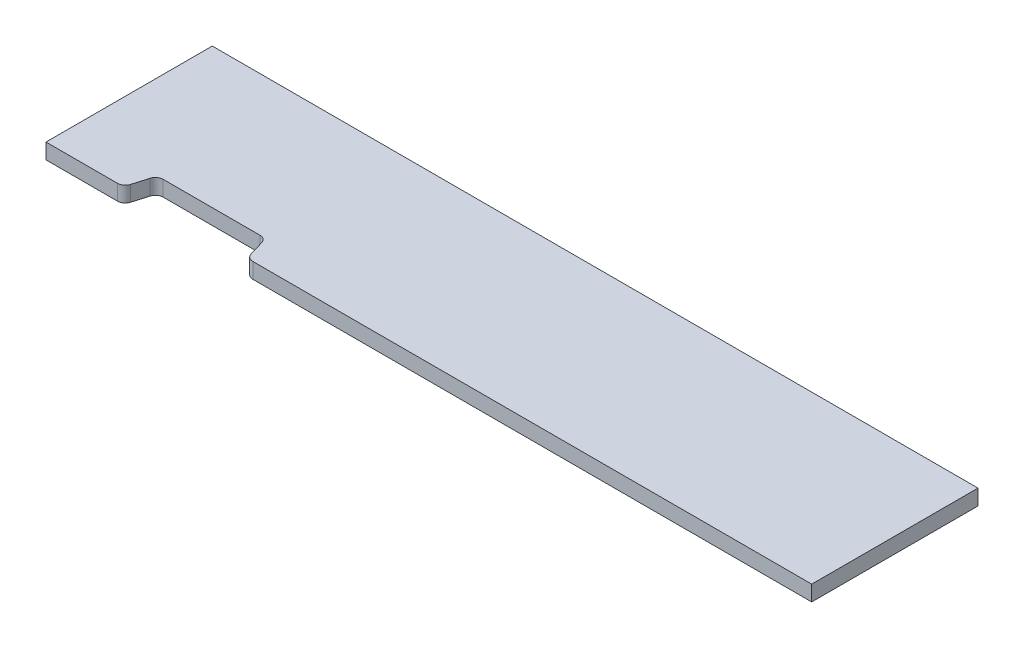
ISO-10303-21;
HEADER;
FILE_DESCRIPTION(('STEP AP214'),'2;1');
FILE_NAME('part.step','',(''),(''),'','','');
FILE_SCHEMA(('AUTOMOTIVE_DESIGN { 1 0 10303 214 1 1 1 1 }'));
ENDSEC;
DATA;
#1=APPLICATION_CONTEXT('core data for automotive mechanical design processes');
#2=APPLICATION_PROTOCOL_DEFINITION('international standard','automotive_design',2000,#1);
#3=PRODUCT_CONTEXT('',#1,'mechanical');
#4=PRODUCT('Part','Part','',(#3));
#5=PRODUCT_RELATED_PRODUCT_CATEGORY('part','',(#4));
#6=PRODUCT_DEFINITION_FORMATION('','',#4);
#7=PRODUCT_DEFINITION_CONTEXT('part definition',#1,'design');
#8=PRODUCT_DEFINITION('design','',#6,#7);
#9=PRODUCT_DEFINITION_SHAPE('','',#8);
#10=(LENGTH_UNIT() NAMED_UNIT(*) SI_UNIT(.MILLI.,.METRE.));
#11=(NAMED_UNIT(*) PLANE_ANGLE_UNIT() SI_UNIT($,.RADIAN.));
#12=(NAMED_UNIT(*) SI_UNIT($,.STERADIAN.) SOLID_ANGLE_UNIT());
#13=UNCERTAINTY_MEASURE_WITH_UNIT(LENGTH_MEASURE(1.E-05),#10,'distance_accuracy_value','');
#14=(GEOMETRIC_REPRESENTATION_CONTEXT(3) GLOBAL_UNCERTAINTY_ASSIGNED_CONTEXT((#13)) GLOBAL_UNIT_ASSIGNED_CONTEXT((#10,
#11,#12)) REPRESENTATION_CONTEXT('',''));
#15=CARTESIAN_POINT('',(0.,0.,0.));
#16=DIRECTION('',(0.,0.,1.));
#17=DIRECTION('',(1.,0.,0.));
#18=AXIS2_PLACEMENT_3D('',#15,#16,#17);
#19=CARTESIAN_POINT('',(-314.325,-12.7,68.2625));
#20=DIRECTION('',(0.,0.,1.));
#21=DIRECTION('',(1.,0.,0.));
#22=AXIS2_PLACEMENT_3D('',#19,#20,#21);
#23=PLANE('',#22);
#24=DIRECTION('',(1.,0.,0.));
#25=VECTOR('',#24,1.);
#26=CARTESIAN_POINT('',(-314.325,-12.7,68.2625));
#27=LINE('',#26,#25);
#28=CARTESIAN_POINT('',(-314.325,-12.7,68.2625));
#29=VERTEX_POINT('',#28);
#30=CARTESIAN_POINT('',(-255.576310981256,-12.7,68.2625));
#31=VERTEX_POINT('',#30);
#32=EDGE_CURVE('E135',#29,#31,#27,.T.);
#33=ORIENTED_EDGE('',*,*,#32,.T.);
#34=DIRECTION('',(0.,1.,0.));
#35=VECTOR('',#34,1.);
#36=CARTESIAN_POINT('',(-255.576310981256,0.,68.2625));
#37=LINE('',#36,#35);
#38=CARTESIAN_POINT('',(-255.576310981256,0.,68.2625));
#39=VERTEX_POINT('',#38);
#40=EDGE_CURVE('E195',#31,#39,#37,.T.);
#41=ORIENTED_EDGE('',*,*,#40,.T.);
#42=DIRECTION('',(1.,0.,0.));
#43=VECTOR('',#42,1.);
#44=CARTESIAN_POINT('',(-314.325,0.,68.2625));
#45=LINE('',#44,#43);
#46=CARTESIAN_POINT('',(-314.325,0.,68.2625));
#47=VERTEX_POINT('',#46);
#48=EDGE_CURVE('E149',#47,#39,#45,.T.);
#49=ORIENTED_EDGE('',*,*,#48,.F.);
#50=DIRECTION('',(0.,1.,0.));
#51=VECTOR('',#50,1.);
#52=CARTESIAN_POINT('',(-314.325,-12.7,68.2625));
#53=LINE('',#52,#51);
#54=EDGE_CURVE('E170',#29,#47,#53,.T.);
#55=ORIENTED_EDGE('',*,*,#54,.F.);
#56=EDGE_LOOP('',(#33,#41,#49,#55));
#57=FACE_BOUND('',#56,.T.);
#58=ADVANCED_FACE('F33',(#57),#23,.T.);
#59=CARTESIAN_POINT('',(314.325,-12.7,68.2625));
#60=DIRECTION('',(1.,0.,0.));
#61=DIRECTION('',(0.,0.,-1.));
#62=AXIS2_PLACEMENT_3D('',#59,#60,#61);
#63=PLANE('',#62);
#64=DIRECTION('',(0.,0.,-1.));
#65=VECTOR('',#64,1.);
#66=CARTESIAN_POINT('',(314.325,0.,68.2625));
#67=LINE('',#66,#65);
#68=CARTESIAN_POINT('',(314.325,0.,68.2625));
#69=VERTEX_POINT('',#68);
#70=CARTESIAN_POINT('',(314.325,0.,-68.2625));
#71=VERTEX_POINT('',#70);
#72=EDGE_CURVE('E161',#69,#71,#67,.T.);
#73=ORIENTED_EDGE('',*,*,#72,.F.);
#74=DIRECTION('',(0.,1.,0.));
#75=VECTOR('',#74,1.);
#76=CARTESIAN_POINT('',(314.325,-12.7,68.2625));
#77=LINE('',#76,#75);
#78=CARTESIAN_POINT('',(314.325,-12.7,68.2625));
#79=VERTEX_POINT('',#78);
#80=EDGE_CURVE('E148',#79,#69,#77,.T.);
#81=ORIENTED_EDGE('',*,*,#80,.F.);
#82=DIRECTION('',(0.,0.,-1.));
#83=VECTOR('',#82,1.);
#84=CARTESIAN_POINT('',(314.325,-12.7,68.2625));
#85=LINE('',#84,#83);
#86=CARTESIAN_POINT('',(314.325,-12.7,-68.2625));
#87=VERTEX_POINT('',#86);
#88=EDGE_CURVE('E141',#79,#87,#85,.T.);
#89=ORIENTED_EDGE('',*,*,#88,.T.);
#90=DIRECTION('',(0.,1.,0.));
#91=VECTOR('',#90,1.);
#92=CARTESIAN_POINT('',(314.325,-12.7,-68.2625));
#93=LINE('',#92,#91);
#94=EDGE_CURVE('E124',#87,#71,#93,.T.);
#95=ORIENTED_EDGE('',*,*,#94,.T.);
#96=EDGE_LOOP('',(#73,#81,#89,#95));
#97=FACE_BOUND('',#96,.T.);
#98=ADVANCED_FACE('F146',(#97),#63,.T.);
#99=CARTESIAN_POINT('',(-144.473689018744,0.,68.2625));
#100=VERTEX_POINT('',#99);
#101=EDGE_CURVE('E152',#100,#69,#45,.T.);
#102=ORIENTED_EDGE('',*,*,#101,.F.);
#103=DIRECTION('',(0.,1.,0.));
#104=VECTOR('',#103,1.);
#105=CARTESIAN_POINT('',(-144.473689018744,-12.7,68.2625));
#106=LINE('',#105,#104);
#107=CARTESIAN_POINT('',(-144.473689018744,-12.7,68.2625));
#108=VERTEX_POINT('',#107);
#109=EDGE_CURVE('E186',#100,#108,#106,.F.);
#110=ORIENTED_EDGE('',*,*,#109,.T.);
#111=EDGE_CURVE('E159',#108,#79,#27,.T.);
#112=ORIENTED_EDGE('',*,*,#111,.T.);
#113=ORIENTED_EDGE('',*,*,#80,.T.);
#114=EDGE_LOOP('',(#102,#110,#112,#113));
#115=FACE_BOUND('',#114,.T.);
#116=ADVANCED_FACE('F245',(#115),#23,.T.);
#117=CARTESIAN_POINT('',(-314.325,-12.7,68.2625));
#118=DIRECTION('',(-1.,0.,0.));
#119=DIRECTION('',(0.,0.,1.));
#120=AXIS2_PLACEMENT_3D('',#117,#118,#119);
#121=PLANE('',#120);
#122=DIRECTION('',(0.,0.,1.));
#123=VECTOR('',#122,1.);
#124=CARTESIAN_POINT('',(-314.325,0.,68.2625));
#125=LINE('',#124,#123);
#126=CARTESIAN_POINT('',(-314.325,0.,-68.2625));
#127=VERTEX_POINT('',#126);
#128=EDGE_CURVE('E165',#127,#47,#125,.T.);
#129=ORIENTED_EDGE('',*,*,#128,.F.);
#130=DIRECTION('',(0.,1.,0.));
#131=VECTOR('',#130,1.);
#132=CARTESIAN_POINT('',(-314.325,-12.7,-68.2625));
#133=LINE('',#132,#131);
#134=CARTESIAN_POINT('',(-314.325,-12.7,-68.2625));
#135=VERTEX_POINT('',#134);
#136=EDGE_CURVE('E134',#135,#127,#133,.T.);
#137=ORIENTED_EDGE('',*,*,#136,.F.);
#138=DIRECTION('',(0.,0.,1.));
#139=VECTOR('',#138,1.);
#140=CARTESIAN_POINT('',(-314.325,-12.7,68.2625));
#141=LINE('',#140,#139);
#142=EDGE_CURVE('E143',#135,#29,#141,.T.);
#143=ORIENTED_EDGE('',*,*,#142,.T.);
#144=ORIENTED_EDGE('',*,*,#54,.T.);
#145=EDGE_LOOP('',(#129,#137,#143,#144));
#146=FACE_BOUND('',#145,.T.);
#147=ADVANCED_FACE('F243',(#146),#121,.T.);
#148=CARTESIAN_POINT('',(-314.325,-12.7,-68.2625));
#149=DIRECTION('',(0.,0.,-1.));
#150=DIRECTION('',(-1.,0.,0.));
#151=AXIS2_PLACEMENT_3D('',#148,#149,#150);
#152=PLANE('',#151);
#153=DIRECTION('',(-1.,0.,0.));
#154=VECTOR('',#153,1.);
#155=CARTESIAN_POINT('',(-314.325,0.,-68.2625));
#156=LINE('',#155,#154);
#157=EDGE_CURVE('E129',#71,#127,#156,.T.);
#158=ORIENTED_EDGE('',*,*,#157,.F.);
#159=ORIENTED_EDGE('',*,*,#94,.F.);
#160=DIRECTION('',(-1.,0.,0.));
#161=VECTOR('',#160,1.);
#162=CARTESIAN_POINT('',(-314.325,-12.7,-68.2625));
#163=LINE('',#162,#161);
#164=EDGE_CURVE('E127',#87,#135,#163,.T.);
#165=ORIENTED_EDGE('',*,*,#164,.T.);
#166=ORIENTED_EDGE('',*,*,#136,.T.);
#167=EDGE_LOOP('',(#158,#159,#165,#166));
#168=FACE_BOUND('',#167,.T.);
#169=ADVANCED_FACE('F126',(#168),#152,.T.);
#170=CARTESIAN_POINT('',(0.,-12.7,0.));
#171=DIRECTION('',(0.,-1.,0.));
#172=DIRECTION('',(0.,0.,-1.));
#173=AXIS2_PLACEMENT_3D('',#170,#171,#172);
#174=PLANE('',#173);
#175=ORIENTED_EDGE('',*,*,#111,.F.);
#176=CARTESIAN_POINT('',(-144.473689018744,-12.7,61.9125));
#177=DIRECTION('',(0.,-1.,0.));
#178=DIRECTION('',(0.,0.,-1.));
#179=AXIS2_PLACEMENT_3D('',#176,#177,#178);
#180=CIRCLE('',#179,6.35);
#181=CARTESIAN_POINT('',(-150.565659953722,-12.7,63.7042561573464));
#182=VERTEX_POINT('',#181);
#183=EDGE_CURVE('E189',#108,#182,#180,.T.);
#184=ORIENTED_EDGE('',*,*,#183,.T.);
#185=DIRECTION('',(-0.28216632399155,0.,-0.959365501571271));
#186=VECTOR('',#185,1.);
#187=CARTESIAN_POINT('',(-155.575,-12.7,46.6725));
#188=LINE('',#187,#186);
#189=CARTESIAN_POINT('',(-154.234340046278,-12.7,51.2307438426537));
#190=VERTEX_POINT('',#189);
#191=EDGE_CURVE('E222',#182,#190,#188,.T.);
#192=ORIENTED_EDGE('',*,*,#191,.T.);
#193=CARTESIAN_POINT('',(-160.326310981256,-12.7,53.0225));
#194=DIRECTION('',(0.,-1.,0.));
#195=DIRECTION('',(0.,0.,-1.));
#196=AXIS2_PLACEMENT_3D('',#193,#194,#195);
#197=CIRCLE('',#196,6.35);
#198=CARTESIAN_POINT('',(-160.326310981256,-12.7,46.6725));
#199=VERTEX_POINT('',#198);
#200=EDGE_CURVE('E200',#190,#199,#197,.F.);
#201=ORIENTED_EDGE('',*,*,#200,.T.);
#202=DIRECTION('',(-1.,0.,0.));
#203=VECTOR('',#202,1.);
#204=CARTESIAN_POINT('',(-244.475,-12.7,46.6725));
#205=LINE('',#204,#203);
#206=CARTESIAN_POINT('',(-239.723689018744,-12.7,46.6725));
#207=VERTEX_POINT('',#206);
#208=EDGE_CURVE('E219',#199,#207,#205,.T.);
#209=ORIENTED_EDGE('',*,*,#208,.T.);
#210=CARTESIAN_POINT('',(-239.723689018744,-12.7,53.0225));
#211=DIRECTION('',(0.,-1.,0.));
#212=DIRECTION('',(0.,0.,-1.));
#213=AXIS2_PLACEMENT_3D('',#210,#211,#212);
#214=CIRCLE('',#213,6.35);
#215=CARTESIAN_POINT('',(-245.815659953722,-12.7,51.2307438426537));
#216=VERTEX_POINT('',#215);
#217=EDGE_CURVE('E11',#207,#216,#214,.F.);
#218=ORIENTED_EDGE('',*,*,#217,.T.);
#219=DIRECTION('',(-0.282166323991551,0.,0.95936550157127));
#220=VECTOR('',#219,1.);
#221=CARTESIAN_POINT('',(-250.825,-12.7,68.2625));
#222=LINE('',#221,#220);
#223=CARTESIAN_POINT('',(-249.484340046278,-12.7,63.7042561573464));
#224=VERTEX_POINT('',#223);
#225=EDGE_CURVE('E163',#216,#224,#222,.T.);
#226=ORIENTED_EDGE('',*,*,#225,.T.);
#227=CARTESIAN_POINT('',(-255.576310981256,-12.7,61.9125));
#228=DIRECTION('',(0.,-1.,0.));
#229=DIRECTION('',(0.,0.,-1.));
#230=AXIS2_PLACEMENT_3D('',#227,#228,#229);
#231=CIRCLE('',#230,6.35);
#232=EDGE_CURVE('E48',#224,#31,#231,.T.);
#233=ORIENTED_EDGE('',*,*,#232,.T.);
#234=ORIENTED_EDGE('',*,*,#32,.F.);
#235=ORIENTED_EDGE('',*,*,#142,.F.);
#236=ORIENTED_EDGE('',*,*,#164,.F.);
#237=ORIENTED_EDGE('',*,*,#88,.F.);
#238=EDGE_LOOP('',(#175,#184,#192,#201,#209,#218,#226,#233,#234,#235,#236,#237));
#239=FACE_BOUND('',#238,.T.);
#240=ADVANCED_FACE('F140',(#239),#174,.T.);
#241=CARTESIAN_POINT('',(0.,0.,0.));
#242=DIRECTION('',(0.,-1.,0.));
#243=DIRECTION('',(0.,0.,-1.));
#244=AXIS2_PLACEMENT_3D('',#241,#242,#243);
#245=PLANE('',#244);
#246=DIRECTION('',(-0.28216632399155,0.,-0.959365501571271));
#247=VECTOR('',#246,1.);
#248=CARTESIAN_POINT('',(-155.575,0.,46.6725));
#249=LINE('',#248,#247);
#250=CARTESIAN_POINT('',(-150.565659953722,0.,63.7042561573464));
#251=VERTEX_POINT('',#250);
#252=CARTESIAN_POINT('',(-154.234340046278,0.,51.2307438426537));
#253=VERTEX_POINT('',#252);
#254=EDGE_CURVE('E216',#251,#253,#249,.T.);
#255=ORIENTED_EDGE('',*,*,#254,.F.);
#256=CARTESIAN_POINT('',(-144.473689018744,0.,61.9125));
#257=DIRECTION('',(0.,-1.,0.));
#258=DIRECTION('',(0.,0.,-1.));
#259=AXIS2_PLACEMENT_3D('',#256,#257,#258);
#260=CIRCLE('',#259,6.35);
#261=EDGE_CURVE('E184',#251,#100,#260,.F.);
#262=ORIENTED_EDGE('',*,*,#261,.T.);
#263=ORIENTED_EDGE('',*,*,#101,.T.);
#264=ORIENTED_EDGE('',*,*,#72,.T.);
#265=ORIENTED_EDGE('',*,*,#157,.T.);
#266=ORIENTED_EDGE('',*,*,#128,.T.);
#267=ORIENTED_EDGE('',*,*,#48,.T.);
#268=CARTESIAN_POINT('',(-255.576310981256,0.,61.9125));
#269=DIRECTION('',(0.,-1.,0.));
#270=DIRECTION('',(0.,0.,-1.));
#271=AXIS2_PLACEMENT_3D('',#268,#269,#270);
#272=CIRCLE('',#271,6.35);
#273=CARTESIAN_POINT('',(-249.484340046278,0.,63.7042561573464));
#274=VERTEX_POINT('',#273);
#275=EDGE_CURVE('E182',#39,#274,#272,.F.);
#276=ORIENTED_EDGE('',*,*,#275,.T.);
#277=DIRECTION('',(-0.282166323991551,0.,0.95936550157127));
#278=VECTOR('',#277,1.);
#279=CARTESIAN_POINT('',(-250.825,0.,68.2625));
#280=LINE('',#279,#278);
#281=CARTESIAN_POINT('',(-245.815659953722,0.,51.2307438426537));
#282=VERTEX_POINT('',#281);
#283=EDGE_CURVE('E155',#282,#274,#280,.T.);
#284=ORIENTED_EDGE('',*,*,#283,.F.);
#285=CARTESIAN_POINT('',(-239.723689018744,0.,53.0225));
#286=DIRECTION('',(0.,-1.,0.));
#287=DIRECTION('',(0.,0.,-1.));
#288=AXIS2_PLACEMENT_3D('',#285,#286,#287);
#289=CIRCLE('',#288,6.35);
#290=CARTESIAN_POINT('',(-239.723689018744,0.,46.6725));
#291=VERTEX_POINT('',#290);
#292=EDGE_CURVE('E41',#282,#291,#289,.T.);
#293=ORIENTED_EDGE('',*,*,#292,.T.);
#294=DIRECTION('',(-1.,0.,0.));
#295=VECTOR('',#294,1.);
#296=CARTESIAN_POINT('',(-244.475,0.,46.6725));
#297=LINE('',#296,#295);
#298=CARTESIAN_POINT('',(-160.326310981256,0.,46.6725));
#299=VERTEX_POINT('',#298);
#300=EDGE_CURVE('E207',#299,#291,#297,.T.);
#301=ORIENTED_EDGE('',*,*,#300,.F.);
#302=CARTESIAN_POINT('',(-160.326310981256,0.,53.0225));
#303=DIRECTION('',(0.,-1.,0.));
#304=DIRECTION('',(0.,0.,-1.));
#305=AXIS2_PLACEMENT_3D('',#302,#303,#304);
#306=CIRCLE('',#305,6.35);
#307=EDGE_CURVE('E198',#299,#253,#306,.T.);
#308=ORIENTED_EDGE('',*,*,#307,.T.);
#309=EDGE_LOOP('',(#255,#262,#263,#264,#265,#266,#267,#276,#284,#293,#301,#308));
#310=FACE_BOUND('',#309,.T.);
#311=ADVANCED_FACE('F206',(#310),#245,.F.);
#312=CARTESIAN_POINT('',(-250.825,-12.7,68.2625));
#313=DIRECTION('',(-0.95936550157127,0.,-0.282166323991551));
#314=DIRECTION('',(-0.282166323991551,0.,0.95936550157127));
#315=AXIS2_PLACEMENT_3D('',#312,#313,#314);
#316=PLANE('',#315);
#317=ORIENTED_EDGE('',*,*,#225,.F.);
#318=DIRECTION('',(0.,1.,0.));
#319=VECTOR('',#318,1.);
#320=CARTESIAN_POINT('',(-245.815659953722,0.,51.2307438426537));
#321=LINE('',#320,#319);
#322=EDGE_CURVE('E192',#216,#282,#321,.T.);
#323=ORIENTED_EDGE('',*,*,#322,.T.);
#324=ORIENTED_EDGE('',*,*,#283,.T.);
#325=DIRECTION('',(0.,1.,0.));
#326=VECTOR('',#325,1.);
#327=CARTESIAN_POINT('',(-249.484340046278,-12.7,63.7042561573464));
#328=LINE('',#327,#326);
#329=EDGE_CURVE('E56',#274,#224,#328,.F.);
#330=ORIENTED_EDGE('',*,*,#329,.T.);
#331=EDGE_LOOP('',(#317,#323,#324,#330));
#332=FACE_BOUND('',#331,.T.);
#333=ADVANCED_FACE('F220',(#332),#316,.F.);
#334=CARTESIAN_POINT('',(-244.475,-12.7,46.6725));
#335=DIRECTION('',(0.,0.,-1.));
#336=DIRECTION('',(-1.,0.,0.));
#337=AXIS2_PLACEMENT_3D('',#334,#335,#336);
#338=PLANE('',#337);
#339=ORIENTED_EDGE('',*,*,#208,.F.);
#340=DIRECTION('',(0.,1.,0.));
#341=VECTOR('',#340,1.);
#342=CARTESIAN_POINT('',(-160.326310981256,0.,46.6725));
#343=LINE('',#342,#341);
#344=EDGE_CURVE('E174',#199,#299,#343,.T.);
#345=ORIENTED_EDGE('',*,*,#344,.T.);
#346=ORIENTED_EDGE('',*,*,#300,.T.);
#347=DIRECTION('',(0.,1.,0.));
#348=VECTOR('',#347,1.);
#349=CARTESIAN_POINT('',(-239.723689018744,-12.7,46.6725));
#350=LINE('',#349,#348);
#351=EDGE_CURVE('E169',#291,#207,#350,.F.);
#352=ORIENTED_EDGE('',*,*,#351,.T.);
#353=EDGE_LOOP('',(#339,#345,#346,#352));
#354=FACE_BOUND('',#353,.T.);
#355=ADVANCED_FACE('F213',(#354),#338,.F.);
#356=CARTESIAN_POINT('',(-155.575,-12.7,46.6725));
#357=DIRECTION('',(0.959365501571271,0.,-0.28216632399155));
#358=DIRECTION('',(-0.28216632399155,0.,-0.959365501571271));
#359=AXIS2_PLACEMENT_3D('',#356,#357,#358);
#360=PLANE('',#359);
#361=ORIENTED_EDGE('',*,*,#254,.T.);
#362=DIRECTION('',(0.,1.,0.));
#363=VECTOR('',#362,1.);
#364=CARTESIAN_POINT('',(-154.234340046278,-12.7,51.2307438426537));
#365=LINE('',#364,#363);
#366=EDGE_CURVE('E180',#253,#190,#365,.F.);
#367=ORIENTED_EDGE('',*,*,#366,.T.);
#368=ORIENTED_EDGE('',*,*,#191,.F.);
#369=DIRECTION('',(0.,1.,0.));
#370=VECTOR('',#369,1.);
#371=CARTESIAN_POINT('',(-150.565659953722,0.,63.7042561573464));
#372=LINE('',#371,#370);
#373=EDGE_CURVE('E177',#182,#251,#372,.T.);
#374=ORIENTED_EDGE('',*,*,#373,.T.);
#375=EDGE_LOOP('',(#361,#367,#368,#374));
#376=FACE_BOUND('',#375,.T.);
#377=ADVANCED_FACE('F229',(#376),#360,.F.);
#378=CARTESIAN_POINT('',(-160.326310981256,-12.7,53.0225));
#379=DIRECTION('',(0.,-1.,0.));
#380=DIRECTION('',(0.,0.,-1.));
#381=AXIS2_PLACEMENT_3D('',#378,#379,#380);
#382=CYLINDRICAL_SURFACE('',#381,6.35);
#383=ORIENTED_EDGE('',*,*,#200,.F.);
#384=ORIENTED_EDGE('',*,*,#366,.F.);
#385=ORIENTED_EDGE('',*,*,#307,.F.);
#386=ORIENTED_EDGE('',*,*,#344,.F.);
#387=EDGE_LOOP('',(#383,#384,#385,#386));
#388=FACE_BOUND('',#387,.T.);
#389=ADVANCED_FACE('F235',(#388),#382,.F.);
#390=CARTESIAN_POINT('',(-144.473689018744,-12.7,61.9125));
#391=DIRECTION('',(0.,-1.,0.));
#392=DIRECTION('',(0.,0.,-1.));
#393=AXIS2_PLACEMENT_3D('',#390,#391,#392);
#394=CYLINDRICAL_SURFACE('',#393,6.35);
#395=ORIENTED_EDGE('',*,*,#183,.F.);
#396=ORIENTED_EDGE('',*,*,#109,.F.);
#397=ORIENTED_EDGE('',*,*,#261,.F.);
#398=ORIENTED_EDGE('',*,*,#373,.F.);
#399=EDGE_LOOP('',(#395,#396,#397,#398));
#400=FACE_BOUND('',#399,.T.);
#401=ADVANCED_FACE('F287',(#400),#394,.T.);
#402=CARTESIAN_POINT('',(-239.723689018744,-12.7,53.0225));
#403=DIRECTION('',(0.,-1.,0.));
#404=DIRECTION('',(0.,0.,-1.));
#405=AXIS2_PLACEMENT_3D('',#402,#403,#404);
#406=CYLINDRICAL_SURFACE('',#405,6.35);
#407=ORIENTED_EDGE('',*,*,#217,.F.);
#408=ORIENTED_EDGE('',*,*,#351,.F.);
#409=ORIENTED_EDGE('',*,*,#292,.F.);
#410=ORIENTED_EDGE('',*,*,#322,.F.);
#411=EDGE_LOOP('',(#407,#408,#409,#410));
#412=FACE_BOUND('',#411,.T.);
#413=ADVANCED_FACE('F218',(#412),#406,.F.);
#414=CARTESIAN_POINT('',(-255.576310981256,-12.7,61.9125));
#415=DIRECTION('',(0.,-1.,0.));
#416=DIRECTION('',(0.,0.,-1.));
#417=AXIS2_PLACEMENT_3D('',#414,#415,#416);
#418=CYLINDRICAL_SURFACE('',#417,6.35);
#419=ORIENTED_EDGE('',*,*,#232,.F.);
#420=ORIENTED_EDGE('',*,*,#329,.F.);
#421=ORIENTED_EDGE('',*,*,#275,.F.);
#422=ORIENTED_EDGE('',*,*,#40,.F.);
#423=EDGE_LOOP('',(#419,#420,#421,#422));
#424=FACE_BOUND('',#423,.T.);
#425=ADVANCED_FACE('F35',(#424),#418,.T.);
#426=CLOSED_SHELL('',(#58,#98,#116,#147,#169,#240,#311,#333,#355,#377,#389,#401,#413,#425));
#427=MANIFOLD_SOLID_BREP('B2',#426);
#428=ADVANCED_BREP_SHAPE_REPRESENTATION('',(#18,#427),#14);
#429=SHAPE_DEFINITION_REPRESENTATION(#9,#428);
ENDSEC;
END-ISO-10303-21;
